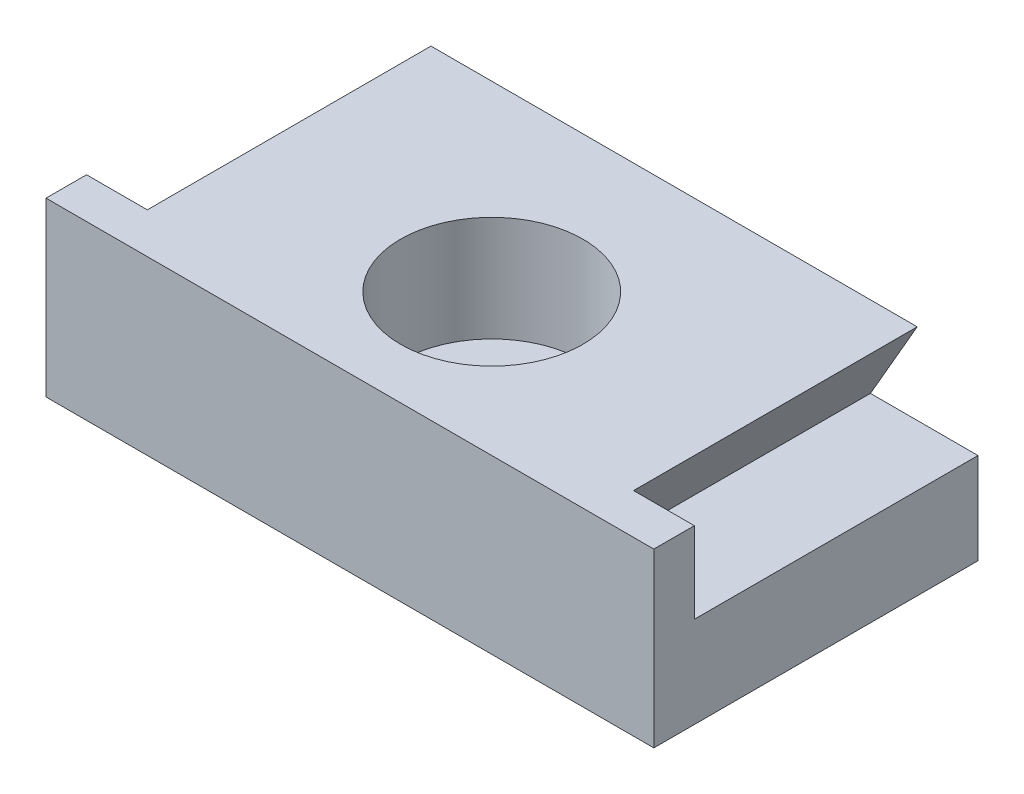
ISO-10303-21;
HEADER;
FILE_DESCRIPTION(('STEP AP214'),'2;1');
FILE_NAME('part.step','',(''),(''),'','','');
FILE_SCHEMA(('AUTOMOTIVE_DESIGN { 1 0 10303 214 1 1 1 1 }'));
ENDSEC;
DATA;
#1=APPLICATION_CONTEXT('core data for automotive mechanical design processes');
#2=APPLICATION_PROTOCOL_DEFINITION('international standard','automotive_design',2000,#1);
#3=PRODUCT_CONTEXT('',#1,'mechanical');
#4=PRODUCT('Part','Part','',(#3));
#5=PRODUCT_RELATED_PRODUCT_CATEGORY('part','',(#4));
#6=PRODUCT_DEFINITION_FORMATION('','',#4);
#7=PRODUCT_DEFINITION_CONTEXT('part definition',#1,'design');
#8=PRODUCT_DEFINITION('design','',#6,#7);
#9=PRODUCT_DEFINITION_SHAPE('','',#8);
#10=(LENGTH_UNIT() NAMED_UNIT(*) SI_UNIT(.MILLI.,.METRE.));
#11=(NAMED_UNIT(*) PLANE_ANGLE_UNIT() SI_UNIT($,.RADIAN.));
#12=(NAMED_UNIT(*) SI_UNIT($,.STERADIAN.) SOLID_ANGLE_UNIT());
#13=UNCERTAINTY_MEASURE_WITH_UNIT(LENGTH_MEASURE(1.E-05),#10,'distance_accuracy_value','');
#14=(GEOMETRIC_REPRESENTATION_CONTEXT(3) GLOBAL_UNCERTAINTY_ASSIGNED_CONTEXT((#13)) GLOBAL_UNIT_ASSIGNED_CONTEXT((#10,
#11,#12)) REPRESENTATION_CONTEXT('',''));
#15=CARTESIAN_POINT('',(0.,0.,0.));
#16=DIRECTION('',(0.,0.,1.));
#17=DIRECTION('',(1.,0.,0.));
#18=AXIS2_PLACEMENT_3D('',#15,#16,#17);
#19=CARTESIAN_POINT('',(0.,8.5,0.));
#20=DIRECTION('',(1.,0.,0.));
#21=DIRECTION('',(0.,0.,-1.));
#22=AXIS2_PLACEMENT_3D('',#19,#20,#21);
#23=PLANE('',#22);
#24=DIRECTION('',(0.,1.,0.));
#25=VECTOR('',#24,1.);
#26=CARTESIAN_POINT('',(0.,4.49888084708997,-2.));
#27=LINE('',#26,#25);
#28=CARTESIAN_POINT('',(0.,4.49888084708997,-2.));
#29=VERTEX_POINT('',#28);
#30=CARTESIAN_POINT('',(0.,8.5,-2.));
#31=VERTEX_POINT('',#30);
#32=EDGE_CURVE('E62',#29,#31,#27,.T.);
#33=ORIENTED_EDGE('',*,*,#32,.F.);
#34=DIRECTION('',(0.,0.,-1.));
#35=VECTOR('',#34,1.);
#36=CARTESIAN_POINT('',(0.,4.49888084708997,-2.));
#37=LINE('',#36,#35);
#38=CARTESIAN_POINT('',(0.,4.49888084708997,-16.));
#39=VERTEX_POINT('',#38);
#40=EDGE_CURVE('E200',#29,#39,#37,.T.);
#41=ORIENTED_EDGE('',*,*,#40,.T.);
#42=DIRECTION('',(0.,-1.,0.));
#43=VECTOR('',#42,1.);
#44=CARTESIAN_POINT('',(0.,8.5,-16.));
#45=LINE('',#44,#43);
#46=CARTESIAN_POINT('',(0.,0.,-16.));
#47=VERTEX_POINT('',#46);
#48=EDGE_CURVE('E144',#39,#47,#45,.T.);
#49=ORIENTED_EDGE('',*,*,#48,.T.);
#50=DIRECTION('',(0.,0.,1.));
#51=VECTOR('',#50,1.);
#52=CARTESIAN_POINT('',(0.,0.,0.));
#53=LINE('',#52,#51);
#54=CARTESIAN_POINT('',(0.,0.,0.));
#55=VERTEX_POINT('',#54);
#56=EDGE_CURVE('E150',#47,#55,#53,.T.);
#57=ORIENTED_EDGE('',*,*,#56,.T.);
#58=DIRECTION('',(0.,-1.,0.));
#59=VECTOR('',#58,1.);
#60=CARTESIAN_POINT('',(0.,8.5,0.));
#61=LINE('',#60,#59);
#62=CARTESIAN_POINT('',(0.,8.5,0.));
#63=VERTEX_POINT('',#62);
#64=EDGE_CURVE('E11',#63,#55,#61,.T.);
#65=ORIENTED_EDGE('',*,*,#64,.F.);
#66=DIRECTION('',(0.,0.,1.));
#67=VECTOR('',#66,1.);
#68=CARTESIAN_POINT('',(0.,8.5,0.));
#69=LINE('',#68,#67);
#70=EDGE_CURVE('E146',#31,#63,#69,.T.);
#71=ORIENTED_EDGE('',*,*,#70,.F.);
#72=EDGE_LOOP('',(#33,#41,#49,#57,#65,#71));
#73=FACE_BOUND('',#72,.T.);
#74=ADVANCED_FACE('F40',(#73),#23,.F.);
#75=CARTESIAN_POINT('',(0.,8.5,0.));
#76=DIRECTION('',(0.,0.,-1.));
#77=DIRECTION('',(-1.,0.,0.));
#78=AXIS2_PLACEMENT_3D('',#75,#76,#77);
#79=PLANE('',#78);
#80=DIRECTION('',(1.,0.,0.));
#81=VECTOR('',#80,1.);
#82=CARTESIAN_POINT('',(0.,0.,0.));
#83=LINE('',#82,#81);
#84=CARTESIAN_POINT('',(30.,0.,0.));
#85=VERTEX_POINT('',#84);
#86=EDGE_CURVE('E153',#55,#85,#83,.T.);
#87=ORIENTED_EDGE('',*,*,#86,.T.);
#88=DIRECTION('',(0.,-1.,0.));
#89=VECTOR('',#88,1.);
#90=CARTESIAN_POINT('',(30.,8.5,0.));
#91=LINE('',#90,#89);
#92=CARTESIAN_POINT('',(30.,8.5,0.));
#93=VERTEX_POINT('',#92);
#94=EDGE_CURVE('E47',#93,#85,#91,.T.);
#95=ORIENTED_EDGE('',*,*,#94,.F.);
#96=DIRECTION('',(1.,0.,0.));
#97=VECTOR('',#96,1.);
#98=CARTESIAN_POINT('',(0.,8.5,0.));
#99=LINE('',#98,#97);
#100=EDGE_CURVE('E139',#63,#93,#99,.T.);
#101=ORIENTED_EDGE('',*,*,#100,.F.);
#102=ORIENTED_EDGE('',*,*,#64,.T.);
#103=EDGE_LOOP('',(#87,#95,#101,#102));
#104=FACE_BOUND('',#103,.T.);
#105=ADVANCED_FACE('F225',(#104),#79,.F.);
#106=CARTESIAN_POINT('',(30.,8.5,0.));
#107=DIRECTION('',(-1.,0.,0.));
#108=DIRECTION('',(0.,0.,1.));
#109=AXIS2_PLACEMENT_3D('',#106,#107,#108);
#110=PLANE('',#109);
#111=DIRECTION('',(0.,-1.,0.));
#112=VECTOR('',#111,1.);
#113=CARTESIAN_POINT('',(30.,8.5,-16.));
#114=LINE('',#113,#112);
#115=CARTESIAN_POINT('',(30.,4.49888084708996,-16.));
#116=VERTEX_POINT('',#115);
#117=CARTESIAN_POINT('',(30.,0.,-16.));
#118=VERTEX_POINT('',#117);
#119=EDGE_CURVE('E163',#116,#118,#114,.T.);
#120=ORIENTED_EDGE('',*,*,#119,.F.);
#121=DIRECTION('',(0.,0.,-1.));
#122=VECTOR('',#121,1.);
#123=CARTESIAN_POINT('',(30.,4.49888084708996,-2.));
#124=LINE('',#123,#122);
#125=CARTESIAN_POINT('',(30.,4.49888084708996,-2.));
#126=VERTEX_POINT('',#125);
#127=EDGE_CURVE('E134',#126,#116,#124,.T.);
#128=ORIENTED_EDGE('',*,*,#127,.F.);
#129=DIRECTION('',(0.,-1.,0.));
#130=VECTOR('',#129,1.);
#131=CARTESIAN_POINT('',(30.,4.49888084708996,-2.));
#132=LINE('',#131,#130);
#133=CARTESIAN_POINT('',(30.,8.5,-2.));
#134=VERTEX_POINT('',#133);
#135=EDGE_CURVE('E121',#134,#126,#132,.T.);
#136=ORIENTED_EDGE('',*,*,#135,.F.);
#137=DIRECTION('',(0.,0.,-1.));
#138=VECTOR('',#137,1.);
#139=CARTESIAN_POINT('',(30.,8.5,0.));
#140=LINE('',#139,#138);
#141=EDGE_CURVE('E133',#93,#134,#140,.T.);
#142=ORIENTED_EDGE('',*,*,#141,.F.);
#143=ORIENTED_EDGE('',*,*,#94,.T.);
#144=DIRECTION('',(0.,0.,-1.));
#145=VECTOR('',#144,1.);
#146=CARTESIAN_POINT('',(30.,0.,0.));
#147=LINE('',#146,#145);
#148=EDGE_CURVE('E156',#85,#118,#147,.T.);
#149=ORIENTED_EDGE('',*,*,#148,.T.);
#150=EDGE_LOOP('',(#120,#128,#136,#142,#143,#149));
#151=FACE_BOUND('',#150,.T.);
#152=ADVANCED_FACE('F131',(#151),#110,.F.);
#153=CARTESIAN_POINT('',(0.,8.5,-16.));
#154=DIRECTION('',(0.,0.,1.));
#155=DIRECTION('',(1.,0.,0.));
#156=AXIS2_PLACEMENT_3D('',#153,#154,#155);
#157=PLANE('',#156);
#158=CARTESIAN_POINT('',(21.5,4.25,-16.));
#159=DIRECTION('',(0.,0.,-1.));
#160=DIRECTION('',(-1.,0.,0.));
#161=AXIS2_PLACEMENT_3D('',#158,#159,#160);
#162=CIRCLE('',#161,2.1);
#163=CARTESIAN_POINT('',(19.4,4.25,-16.));
#164=VERTEX_POINT('',#163);
#165=EDGE_CURVE('E244',#164,#164,#162,.T.);
#166=ORIENTED_EDGE('',*,*,#165,.F.);
#167=EDGE_LOOP('',(#166));
#168=FACE_BOUND('',#167,.T.);
#169=CARTESIAN_POINT('',(8.5,4.25,-16.));
#170=DIRECTION('',(0.,0.,-1.));
#171=DIRECTION('',(1.,0.,0.));
#172=AXIS2_PLACEMENT_3D('',#169,#170,#171);
#173=CIRCLE('',#172,2.1);
#174=CARTESIAN_POINT('',(10.6,4.25,-16.));
#175=VERTEX_POINT('',#174);
#176=EDGE_CURVE('E240',#175,#175,#173,.T.);
#177=ORIENTED_EDGE('',*,*,#176,.F.);
#178=EDGE_LOOP('',(#177));
#179=FACE_BOUND('',#178,.T.);
#180=DIRECTION('',(-1.,0.,0.));
#181=VECTOR('',#180,1.);
#182=CARTESIAN_POINT('',(0.,8.5,-16.));
#183=LINE('',#182,#181);
#184=CARTESIAN_POINT('',(27.,8.5,-16.));
#185=VERTEX_POINT('',#184);
#186=CARTESIAN_POINT('',(3.,8.50000000000001,-16.));
#187=VERTEX_POINT('',#186);
#188=EDGE_CURVE('E141',#185,#187,#183,.T.);
#189=ORIENTED_EDGE('',*,*,#188,.F.);
#190=DIRECTION('',(0.500000000000005,0.866025403784436,0.));
#191=VECTOR('',#190,1.);
#192=CARTESIAN_POINT('',(27.,8.5,-16.));
#193=LINE('',#192,#191);
#194=CARTESIAN_POINT('',(24.6899527800076,4.49888084708997,-16.));
#195=VERTEX_POINT('',#194);
#196=EDGE_CURVE('E126',#195,#185,#193,.T.);
#197=ORIENTED_EDGE('',*,*,#196,.F.);
#198=DIRECTION('',(-1.,0.,0.));
#199=VECTOR('',#198,1.);
#200=CARTESIAN_POINT('',(24.6899527800076,4.49888084708997,-16.));
#201=LINE('',#200,#199);
#202=EDGE_CURVE('E178',#116,#195,#201,.T.);
#203=ORIENTED_EDGE('',*,*,#202,.F.);
#204=ORIENTED_EDGE('',*,*,#119,.T.);
#205=DIRECTION('',(-1.,0.,0.));
#206=VECTOR('',#205,1.);
#207=CARTESIAN_POINT('',(0.,0.,-16.));
#208=LINE('',#207,#206);
#209=EDGE_CURVE('E159',#118,#47,#208,.T.);
#210=ORIENTED_EDGE('',*,*,#209,.T.);
#211=ORIENTED_EDGE('',*,*,#48,.F.);
#212=DIRECTION('',(-1.,0.,0.));
#213=VECTOR('',#212,1.);
#214=CARTESIAN_POINT('',(5.3100472199924,4.49888084708997,-16.));
#215=LINE('',#214,#213);
#216=CARTESIAN_POINT('',(5.3100472199924,4.49888084708997,-16.));
#217=VERTEX_POINT('',#216);
#218=EDGE_CURVE('E184',#217,#39,#215,.T.);
#219=ORIENTED_EDGE('',*,*,#218,.F.);
#220=DIRECTION('',(0.500000000000004,-0.866025403784436,0.));
#221=VECTOR('',#220,1.);
#222=CARTESIAN_POINT('',(3.,8.50000000000001,-16.));
#223=LINE('',#222,#221);
#224=EDGE_CURVE('E180',#187,#217,#223,.T.);
#225=ORIENTED_EDGE('',*,*,#224,.F.);
#226=EDGE_LOOP('',(#189,#197,#203,#204,#210,#211,#219,#225));
#227=FACE_BOUND('',#226,.T.);
#228=ADVANCED_FACE('F173',(#168,#179,#227),#157,.F.);
#229=CARTESIAN_POINT('',(0.,8.5,0.));
#230=DIRECTION('',(0.,-1.,0.));
#231=DIRECTION('',(0.,0.,-1.));
#232=AXIS2_PLACEMENT_3D('',#229,#230,#231);
#233=PLANE('',#232);
#234=CARTESIAN_POINT('',(15.,8.5,-7.));
#235=DIRECTION('',(0.,1.,0.));
#236=DIRECTION('',(0.,0.,1.));
#237=AXIS2_PLACEMENT_3D('',#234,#235,#236);
#238=CIRCLE('',#237,4.5);
#239=CARTESIAN_POINT('',(15.,8.5,-2.5));
#240=VERTEX_POINT('',#239);
#241=EDGE_CURVE('E215',#240,#240,#238,.T.);
#242=ORIENTED_EDGE('',*,*,#241,.F.);
#243=EDGE_LOOP('',(#242));
#244=FACE_BOUND('',#243,.T.);
#245=DIRECTION('',(1.,0.,0.));
#246=VECTOR('',#245,1.);
#247=CARTESIAN_POINT('',(30.,8.5,-2.));
#248=LINE('',#247,#246);
#249=CARTESIAN_POINT('',(27.,8.5,-2.));
#250=VERTEX_POINT('',#249);
#251=EDGE_CURVE('E118',#250,#134,#248,.T.);
#252=ORIENTED_EDGE('',*,*,#251,.F.);
#253=DIRECTION('',(0.,0.,-1.));
#254=VECTOR('',#253,1.);
#255=CARTESIAN_POINT('',(27.,8.5,-2.));
#256=LINE('',#255,#254);
#257=EDGE_CURVE('E189',#250,#185,#256,.T.);
#258=ORIENTED_EDGE('',*,*,#257,.T.);
#259=ORIENTED_EDGE('',*,*,#188,.T.);
#260=DIRECTION('',(0.,0.,-1.));
#261=VECTOR('',#260,1.);
#262=CARTESIAN_POINT('',(3.,8.50000000000001,-2.));
#263=LINE('',#262,#261);
#264=CARTESIAN_POINT('',(3.,8.50000000000001,-2.));
#265=VERTEX_POINT('',#264);
#266=EDGE_CURVE('E195',#265,#187,#263,.T.);
#267=ORIENTED_EDGE('',*,*,#266,.F.);
#268=DIRECTION('',(1.,0.,0.));
#269=VECTOR('',#268,1.);
#270=CARTESIAN_POINT('',(0.,8.5,-2.));
#271=LINE('',#270,#269);
#272=EDGE_CURVE('E209',#31,#265,#271,.T.);
#273=ORIENTED_EDGE('',*,*,#272,.F.);
#274=ORIENTED_EDGE('',*,*,#70,.T.);
#275=ORIENTED_EDGE('',*,*,#100,.T.);
#276=ORIENTED_EDGE('',*,*,#141,.T.);
#277=EDGE_LOOP('',(#252,#258,#259,#267,#273,#274,#275,#276));
#278=FACE_BOUND('',#277,.T.);
#279=ADVANCED_FACE('F137',(#244,#278),#233,.F.);
#280=CARTESIAN_POINT('',(0.,0.,0.));
#281=DIRECTION('',(0.,-1.,0.));
#282=DIRECTION('',(0.,0.,-1.));
#283=AXIS2_PLACEMENT_3D('',#280,#281,#282);
#284=PLANE('',#283);
#285=CARTESIAN_POINT('',(10.1192259751539,0.,-7.));
#286=DIRECTION('',(0.,-1.,0.));
#287=DIRECTION('',(0.,0.,-1.));
#288=AXIS2_PLACEMENT_3D('',#285,#286,#287);
#289=CIRCLE('',#288,1.1);
#290=CARTESIAN_POINT('',(10.1192259751539,0.,-8.1));
#291=VERTEX_POINT('',#290);
#292=EDGE_CURVE('E255',#291,#291,#289,.T.);
#293=ORIENTED_EDGE('',*,*,#292,.F.);
#294=EDGE_LOOP('',(#293));
#295=FACE_BOUND('',#294,.T.);
#296=CARTESIAN_POINT('',(19.8807740248461,0.,-7.));
#297=DIRECTION('',(0.,-1.,0.));
#298=DIRECTION('',(0.,0.,-1.));
#299=AXIS2_PLACEMENT_3D('',#296,#297,#298);
#300=CIRCLE('',#299,1.1);
#301=CARTESIAN_POINT('',(19.8807740248461,0.,-8.1));
#302=VERTEX_POINT('',#301);
#303=EDGE_CURVE('E252',#302,#302,#300,.T.);
#304=ORIENTED_EDGE('',*,*,#303,.F.);
#305=EDGE_LOOP('',(#304));
#306=FACE_BOUND('',#305,.T.);
#307=CARTESIAN_POINT('',(15.,0.,-7.));
#308=DIRECTION('',(0.,1.,0.));
#309=DIRECTION('',(0.,0.,1.));
#310=AXIS2_PLACEMENT_3D('',#307,#308,#309);
#311=CIRCLE('',#310,2.65);
#312=CARTESIAN_POINT('',(15.,0.,-4.35));
#313=VERTEX_POINT('',#312);
#314=EDGE_CURVE('E212',#313,#313,#311,.T.);
#315=ORIENTED_EDGE('',*,*,#314,.T.);
#316=EDGE_LOOP('',(#315));
#317=FACE_BOUND('',#316,.T.);
#318=ORIENTED_EDGE('',*,*,#56,.F.);
#319=ORIENTED_EDGE('',*,*,#209,.F.);
#320=ORIENTED_EDGE('',*,*,#148,.F.);
#321=ORIENTED_EDGE('',*,*,#86,.F.);
#322=EDGE_LOOP('',(#318,#319,#320,#321));
#323=FACE_BOUND('',#322,.T.);
#324=ADVANCED_FACE('F169',(#295,#306,#317,#323),#284,.T.);
#325=CARTESIAN_POINT('',(15.,3.3,-7.));
#326=DIRECTION('',(0.,1.,0.));
#327=DIRECTION('',(0.,0.,1.));
#328=AXIS2_PLACEMENT_3D('',#325,#326,#327);
#329=CYLINDRICAL_SURFACE('',#328,4.5);
#330=CARTESIAN_POINT('',(15.,3.3,-7.));
#331=DIRECTION('',(0.,1.,0.));
#332=DIRECTION('',(0.,0.,1.));
#333=AXIS2_PLACEMENT_3D('',#330,#331,#332);
#334=CIRCLE('',#333,4.5);
#335=CARTESIAN_POINT('',(15.,3.3,-2.5));
#336=VERTEX_POINT('',#335);
#337=EDGE_CURVE('E154',#336,#336,#334,.T.);
#338=ORIENTED_EDGE('',*,*,#337,.F.);
#339=EDGE_LOOP('',(#338));
#340=FACE_BOUND('',#339,.T.);
#341=ORIENTED_EDGE('',*,*,#241,.T.);
#342=EDGE_LOOP('',(#341));
#343=FACE_BOUND('',#342,.T.);
#344=ADVANCED_FACE('F272',(#340,#343),#329,.F.);
#345=CARTESIAN_POINT('',(15.,3.3,-7.));
#346=DIRECTION('',(0.,1.,0.));
#347=DIRECTION('',(0.,0.,1.));
#348=AXIS2_PLACEMENT_3D('',#345,#346,#347);
#349=PLANE('',#348);
#350=CARTESIAN_POINT('',(15.,3.3,-7.));
#351=DIRECTION('',(0.,1.,0.));
#352=DIRECTION('',(0.,0.,1.));
#353=AXIS2_PLACEMENT_3D('',#350,#351,#352);
#354=CIRCLE('',#353,2.65);
#355=CARTESIAN_POINT('',(15.,3.3,-4.35));
#356=VERTEX_POINT('',#355);
#357=EDGE_CURVE('E191',#356,#356,#354,.T.);
#358=ORIENTED_EDGE('',*,*,#357,.F.);
#359=EDGE_LOOP('',(#358));
#360=FACE_BOUND('',#359,.T.);
#361=ORIENTED_EDGE('',*,*,#337,.T.);
#362=EDGE_LOOP('',(#361));
#363=FACE_BOUND('',#362,.T.);
#364=ADVANCED_FACE('F281',(#360,#363),#349,.T.);
#365=CARTESIAN_POINT('',(15.,0.,-7.));
#366=DIRECTION('',(0.,1.,0.));
#367=DIRECTION('',(0.,0.,1.));
#368=AXIS2_PLACEMENT_3D('',#365,#366,#367);
#369=CYLINDRICAL_SURFACE('',#368,2.65);
#370=ORIENTED_EDGE('',*,*,#314,.F.);
#371=EDGE_LOOP('',(#370));
#372=FACE_BOUND('',#371,.T.);
#373=ORIENTED_EDGE('',*,*,#357,.T.);
#374=EDGE_LOOP('',(#373));
#375=FACE_BOUND('',#374,.T.);
#376=ADVANCED_FACE('F278',(#372,#375),#369,.F.);
#377=CARTESIAN_POINT('',(5.3100472199924,4.49888084708997,-2.));
#378=DIRECTION('',(0.,-1.,0.));
#379=DIRECTION('',(1.,0.,0.));
#380=AXIS2_PLACEMENT_3D('',#377,#378,#379);
#381=PLANE('',#380);
#382=ORIENTED_EDGE('',*,*,#218,.T.);
#383=ORIENTED_EDGE('',*,*,#40,.F.);
#384=DIRECTION('',(-1.,0.,0.));
#385=VECTOR('',#384,1.);
#386=CARTESIAN_POINT('',(5.3100472199924,4.49888084708997,-2.));
#387=LINE('',#386,#385);
#388=CARTESIAN_POINT('',(5.3100472199924,4.49888084708997,-2.));
#389=VERTEX_POINT('',#388);
#390=EDGE_CURVE('E197',#389,#29,#387,.T.);
#391=ORIENTED_EDGE('',*,*,#390,.F.);
#392=DIRECTION('',(0.,0.,-1.));
#393=VECTOR('',#392,1.);
#394=CARTESIAN_POINT('',(5.3100472199924,4.49888084708997,-2.));
#395=LINE('',#394,#393);
#396=EDGE_CURVE('E198',#389,#217,#395,.T.);
#397=ORIENTED_EDGE('',*,*,#396,.T.);
#398=EDGE_LOOP('',(#382,#383,#391,#397));
#399=FACE_BOUND('',#398,.T.);
#400=ADVANCED_FACE('F228',(#399),#381,.F.);
#401=CARTESIAN_POINT('',(3.,8.50000000000001,-2.));
#402=DIRECTION('',(0.866025403784436,0.500000000000004,0.));
#403=DIRECTION('',(-0.500000000000005,0.866025403784436,0.));
#404=AXIS2_PLACEMENT_3D('',#401,#402,#403);
#405=PLANE('',#404);
#406=ORIENTED_EDGE('',*,*,#224,.T.);
#407=ORIENTED_EDGE('',*,*,#396,.F.);
#408=DIRECTION('',(0.500000000000004,-0.866025403784436,0.));
#409=VECTOR('',#408,1.);
#410=CARTESIAN_POINT('',(3.,8.50000000000001,-2.));
#411=LINE('',#410,#409);
#412=EDGE_CURVE('E206',#265,#389,#411,.T.);
#413=ORIENTED_EDGE('',*,*,#412,.F.);
#414=ORIENTED_EDGE('',*,*,#266,.T.);
#415=EDGE_LOOP('',(#406,#407,#413,#414));
#416=FACE_BOUND('',#415,.T.);
#417=ADVANCED_FACE('F231',(#416),#405,.F.);
#418=CARTESIAN_POINT('',(0.,0.,-2.));
#419=DIRECTION('',(0.,0.,-1.));
#420=DIRECTION('',(-1.,0.,0.));
#421=AXIS2_PLACEMENT_3D('',#418,#419,#420);
#422=PLANE('',#421);
#423=ORIENTED_EDGE('',*,*,#32,.T.);
#424=ORIENTED_EDGE('',*,*,#272,.T.);
#425=ORIENTED_EDGE('',*,*,#412,.T.);
#426=ORIENTED_EDGE('',*,*,#390,.T.);
#427=EDGE_LOOP('',(#423,#424,#425,#426));
#428=FACE_BOUND('',#427,.T.);
#429=ADVANCED_FACE('F229',(#428),#422,.T.);
#430=CARTESIAN_POINT('',(27.,8.5,-2.));
#431=DIRECTION('',(-0.866025403784436,0.500000000000005,0.));
#432=DIRECTION('',(-0.500000000000005,-0.866025403784436,0.));
#433=AXIS2_PLACEMENT_3D('',#430,#431,#432);
#434=PLANE('',#433);
#435=ORIENTED_EDGE('',*,*,#196,.T.);
#436=ORIENTED_EDGE('',*,*,#257,.F.);
#437=DIRECTION('',(0.500000000000005,0.866025403784436,0.));
#438=VECTOR('',#437,1.);
#439=CARTESIAN_POINT('',(27.,8.5,-2.));
#440=LINE('',#439,#438);
#441=CARTESIAN_POINT('',(24.6899527800076,4.49888084708997,-2.));
#442=VERTEX_POINT('',#441);
#443=EDGE_CURVE('E54',#442,#250,#440,.T.);
#444=ORIENTED_EDGE('',*,*,#443,.F.);
#445=DIRECTION('',(0.,0.,-1.));
#446=VECTOR('',#445,1.);
#447=CARTESIAN_POINT('',(24.6899527800076,4.49888084708997,-2.));
#448=LINE('',#447,#446);
#449=EDGE_CURVE('E192',#442,#195,#448,.T.);
#450=ORIENTED_EDGE('',*,*,#449,.T.);
#451=EDGE_LOOP('',(#435,#436,#444,#450));
#452=FACE_BOUND('',#451,.T.);
#453=ADVANCED_FACE('F234',(#452),#434,.F.);
#454=CARTESIAN_POINT('',(24.6899527800076,4.49888084708997,-2.));
#455=DIRECTION('',(0.,-1.,0.));
#456=DIRECTION('',(1.,0.,0.));
#457=AXIS2_PLACEMENT_3D('',#454,#455,#456);
#458=PLANE('',#457);
#459=ORIENTED_EDGE('',*,*,#202,.T.);
#460=ORIENTED_EDGE('',*,*,#449,.F.);
#461=DIRECTION('',(-1.,0.,0.));
#462=VECTOR('',#461,1.);
#463=CARTESIAN_POINT('',(24.6899527800076,4.49888084708997,-2.));
#464=LINE('',#463,#462);
#465=EDGE_CURVE('E135',#126,#442,#464,.T.);
#466=ORIENTED_EDGE('',*,*,#465,.F.);
#467=ORIENTED_EDGE('',*,*,#127,.T.);
#468=EDGE_LOOP('',(#459,#460,#466,#467));
#469=FACE_BOUND('',#468,.T.);
#470=ADVANCED_FACE('F235',(#469),#458,.F.);
#471=CARTESIAN_POINT('',(0.,0.,-2.));
#472=DIRECTION('',(0.,0.,-1.));
#473=DIRECTION('',(-1.,0.,0.));
#474=AXIS2_PLACEMENT_3D('',#471,#472,#473);
#475=PLANE('',#474);
#476=ORIENTED_EDGE('',*,*,#251,.T.);
#477=ORIENTED_EDGE('',*,*,#135,.T.);
#478=ORIENTED_EDGE('',*,*,#465,.T.);
#479=ORIENTED_EDGE('',*,*,#443,.T.);
#480=EDGE_LOOP('',(#476,#477,#478,#479));
#481=FACE_BOUND('',#480,.T.);
#482=ADVANCED_FACE('F120',(#481),#475,.T.);
#483=CARTESIAN_POINT('',(8.5,4.25,-9.));
#484=DIRECTION('',(0.,0.,-1.));
#485=DIRECTION('',(-1.,0.,0.));
#486=AXIS2_PLACEMENT_3D('',#483,#484,#485);
#487=CYLINDRICAL_SURFACE('',#486,2.1);
#488=CARTESIAN_POINT('',(8.5,4.25,-9.));
#489=DIRECTION('',(0.,0.,-1.));
#490=DIRECTION('',(1.,0.,0.));
#491=AXIS2_PLACEMENT_3D('',#488,#489,#490);
#492=CIRCLE('',#491,2.1);
#493=CARTESIAN_POINT('',(10.6,4.25,-9.));
#494=VERTEX_POINT('',#493);
#495=EDGE_CURVE('E237',#494,#494,#492,.T.);
#496=ORIENTED_EDGE('',*,*,#495,.F.);
#497=EDGE_LOOP('',(#496));
#498=FACE_BOUND('',#497,.T.);
#499=ORIENTED_EDGE('',*,*,#176,.T.);
#500=EDGE_LOOP('',(#499));
#501=FACE_BOUND('',#500,.T.);
#502=ADVANCED_FACE('F328',(#498,#501),#487,.F.);
#503=CARTESIAN_POINT('',(8.5,4.25,-9.));
#504=DIRECTION('',(0.,0.,1.));
#505=DIRECTION('',(1.,0.,0.));
#506=AXIS2_PLACEMENT_3D('',#503,#504,#505);
#507=PLANE('',#506);
#508=ORIENTED_EDGE('',*,*,#495,.T.);
#509=EDGE_LOOP('',(#508));
#510=FACE_BOUND('',#509,.T.);
#511=ADVANCED_FACE('F333',(#510),#507,.F.);
#512=CARTESIAN_POINT('',(21.5,4.25,-9.));
#513=DIRECTION('',(0.,0.,-1.));
#514=DIRECTION('',(-1.,0.,0.));
#515=AXIS2_PLACEMENT_3D('',#512,#513,#514);
#516=CYLINDRICAL_SURFACE('',#515,2.1);
#517=CARTESIAN_POINT('',(21.5,4.25,-9.));
#518=DIRECTION('',(0.,0.,-1.));
#519=DIRECTION('',(-1.,0.,0.));
#520=AXIS2_PLACEMENT_3D('',#517,#518,#519);
#521=CIRCLE('',#520,2.1);
#522=CARTESIAN_POINT('',(19.4,4.25,-9.));
#523=VERTEX_POINT('',#522);
#524=EDGE_CURVE('E203',#523,#523,#521,.T.);
#525=ORIENTED_EDGE('',*,*,#524,.F.);
#526=EDGE_LOOP('',(#525));
#527=FACE_BOUND('',#526,.T.);
#528=ORIENTED_EDGE('',*,*,#165,.T.);
#529=EDGE_LOOP('',(#528));
#530=FACE_BOUND('',#529,.T.);
#531=ADVANCED_FACE('F344',(#527,#530),#516,.F.);
#532=CARTESIAN_POINT('',(21.5,4.25,-9.));
#533=DIRECTION('',(0.,0.,-1.));
#534=DIRECTION('',(-1.,0.,0.));
#535=AXIS2_PLACEMENT_3D('',#532,#533,#534);
#536=PLANE('',#535);
#537=ORIENTED_EDGE('',*,*,#524,.T.);
#538=EDGE_LOOP('',(#537));
#539=FACE_BOUND('',#538,.T.);
#540=ADVANCED_FACE('F355',(#539),#536,.T.);
#541=CARTESIAN_POINT('',(19.8807740248461,2.5,-7.));
#542=DIRECTION('',(0.,-1.,0.));
#543=DIRECTION('',(0.,0.,-1.));
#544=AXIS2_PLACEMENT_3D('',#541,#542,#543);
#545=CYLINDRICAL_SURFACE('',#544,1.1);
#546=CARTESIAN_POINT('',(19.8807740248461,2.5,-7.));
#547=DIRECTION('',(0.,-1.,0.));
#548=DIRECTION('',(0.,0.,-1.));
#549=AXIS2_PLACEMENT_3D('',#546,#547,#548);
#550=CIRCLE('',#549,1.1);
#551=CARTESIAN_POINT('',(19.8807740248461,2.5,-8.1));
#552=VERTEX_POINT('',#551);
#553=EDGE_CURVE('E249',#552,#552,#550,.T.);
#554=ORIENTED_EDGE('',*,*,#553,.F.);
#555=EDGE_LOOP('',(#554));
#556=FACE_BOUND('',#555,.T.);
#557=ORIENTED_EDGE('',*,*,#303,.T.);
#558=EDGE_LOOP('',(#557));
#559=FACE_BOUND('',#558,.T.);
#560=ADVANCED_FACE('F366',(#556,#559),#545,.F.);
#561=CARTESIAN_POINT('',(19.8807740248461,2.5,-7.));
#562=DIRECTION('',(0.,-1.,0.));
#563=DIRECTION('',(0.,0.,-1.));
#564=AXIS2_PLACEMENT_3D('',#561,#562,#563);
#565=PLANE('',#564);
#566=ORIENTED_EDGE('',*,*,#553,.T.);
#567=EDGE_LOOP('',(#566));
#568=FACE_BOUND('',#567,.T.);
#569=ADVANCED_FACE('F266',(#568),#565,.T.);
#570=CARTESIAN_POINT('',(10.1192259751539,2.5,-7.));
#571=DIRECTION('',(0.,-1.,0.));
#572=DIRECTION('',(0.,0.,-1.));
#573=AXIS2_PLACEMENT_3D('',#570,#571,#572);
#574=CYLINDRICAL_SURFACE('',#573,1.1);
#575=CARTESIAN_POINT('',(10.1192259751539,2.5,-7.));
#576=DIRECTION('',(0.,-1.,0.));
#577=DIRECTION('',(0.,0.,-1.));
#578=AXIS2_PLACEMENT_3D('',#575,#576,#577);
#579=CIRCLE('',#578,1.1);
#580=CARTESIAN_POINT('',(10.1192259751539,2.5,-8.1));
#581=VERTEX_POINT('',#580);
#582=EDGE_CURVE('E241',#581,#581,#579,.T.);
#583=ORIENTED_EDGE('',*,*,#582,.F.);
#584=EDGE_LOOP('',(#583));
#585=FACE_BOUND('',#584,.T.);
#586=ORIENTED_EDGE('',*,*,#292,.T.);
#587=EDGE_LOOP('',(#586));
#588=FACE_BOUND('',#587,.T.);
#589=ADVANCED_FACE('F263',(#585,#588),#574,.F.);
#590=CARTESIAN_POINT('',(10.1192259751539,2.5,-7.));
#591=DIRECTION('',(0.,-1.,0.));
#592=DIRECTION('',(0.,0.,-1.));
#593=AXIS2_PLACEMENT_3D('',#590,#591,#592);
#594=PLANE('',#593);
#595=ORIENTED_EDGE('',*,*,#582,.T.);
#596=EDGE_LOOP('',(#595));
#597=FACE_BOUND('',#596,.T.);
#598=ADVANCED_FACE('F261',(#597),#594,.T.);
#599=CLOSED_SHELL('',(#74,#105,#152,#228,#279,#324,#344,#364,#376,#400,#417,#429,#453,#470,#482,
#502,#511,#531,#540,#560,#569,#589,#598));
#600=MANIFOLD_SOLID_BREP('B2',#599);
#601=ADVANCED_BREP_SHAPE_REPRESENTATION('',(#18,#600),#14);
#602=SHAPE_DEFINITION_REPRESENTATION(#9,#601);
ENDSEC;
END-ISO-10303-21;
